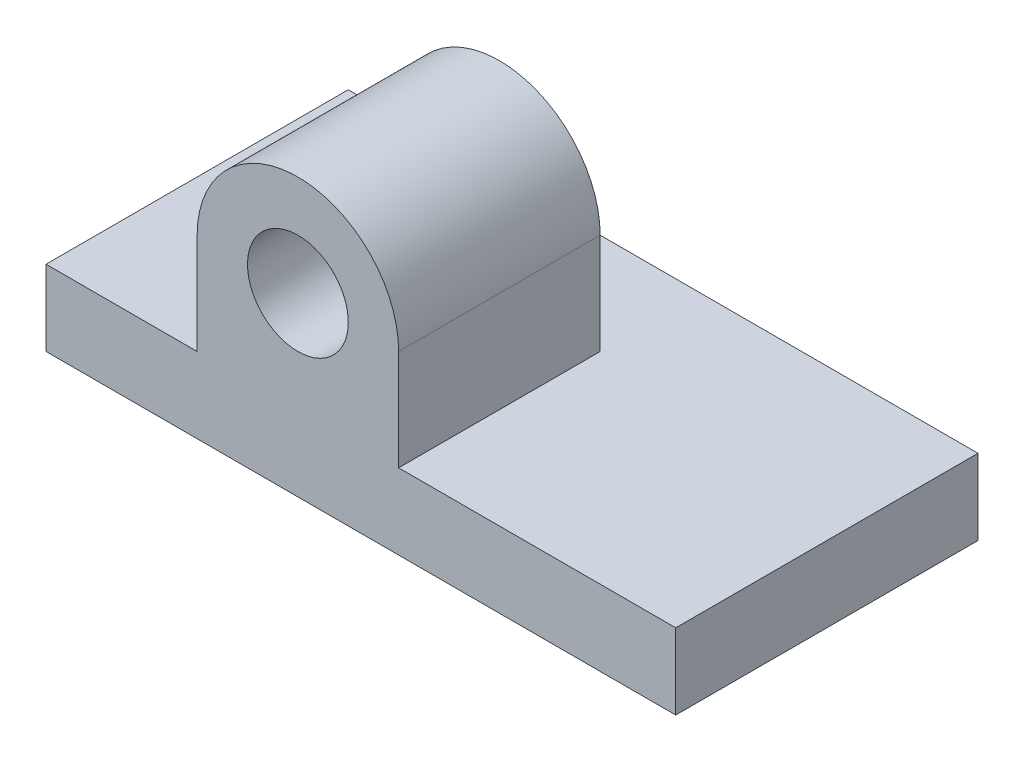
ISO-10303-21;
HEADER;
FILE_DESCRIPTION(('STEP AP214'),'2;1');
FILE_NAME('part.step','',(''),(''),'','','');
FILE_SCHEMA(('AUTOMOTIVE_DESIGN { 1 0 10303 214 1 1 1 1 }'));
ENDSEC;
DATA;
#1=APPLICATION_CONTEXT('core data for automotive mechanical design processes');
#2=APPLICATION_PROTOCOL_DEFINITION('international standard','automotive_design',2000,#1);
#3=PRODUCT_CONTEXT('',#1,'mechanical');
#4=PRODUCT('Part','Part','',(#3));
#5=PRODUCT_RELATED_PRODUCT_CATEGORY('part','',(#4));
#6=PRODUCT_DEFINITION_FORMATION('','',#4);
#7=PRODUCT_DEFINITION_CONTEXT('part definition',#1,'design');
#8=PRODUCT_DEFINITION('design','',#6,#7);
#9=PRODUCT_DEFINITION_SHAPE('','',#8);
#10=(LENGTH_UNIT() NAMED_UNIT(*) SI_UNIT(.MILLI.,.METRE.));
#11=(NAMED_UNIT(*) PLANE_ANGLE_UNIT() SI_UNIT($,.RADIAN.));
#12=(NAMED_UNIT(*) SI_UNIT($,.STERADIAN.) SOLID_ANGLE_UNIT());
#13=UNCERTAINTY_MEASURE_WITH_UNIT(LENGTH_MEASURE(1.E-05),#10,'distance_accuracy_value','');
#14=(GEOMETRIC_REPRESENTATION_CONTEXT(3) GLOBAL_UNCERTAINTY_ASSIGNED_CONTEXT((#13)) GLOBAL_UNIT_ASSIGNED_CONTEXT((#10,
#11,#12)) REPRESENTATION_CONTEXT('',''));
#15=CARTESIAN_POINT('',(0.,0.,0.));
#16=DIRECTION('',(0.,0.,1.));
#17=DIRECTION('',(1.,0.,0.));
#18=AXIS2_PLACEMENT_3D('',#15,#16,#17);
#19=CARTESIAN_POINT('',(0.,15.,-60.));
#20=DIRECTION('',(0.,-1.,0.));
#21=DIRECTION('',(0.,0.,-1.));
#22=AXIS2_PLACEMENT_3D('',#19,#20,#21);
#23=PLANE('',#22);
#24=DIRECTION('',(0.,0.,1.));
#25=VECTOR('',#24,1.);
#26=CARTESIAN_POINT('',(30.,15.,-40.));
#27=LINE('',#26,#25);
#28=CARTESIAN_POINT('',(30.,15.,-40.));
#29=VERTEX_POINT('',#28);
#30=CARTESIAN_POINT('',(30.,15.,0.));
#31=VERTEX_POINT('',#30);
#32=EDGE_CURVE('E135',#29,#31,#27,.T.);
#33=ORIENTED_EDGE('',*,*,#32,.F.);
#34=DIRECTION('',(1.,0.,0.));
#35=VECTOR('',#34,1.);
#36=CARTESIAN_POINT('',(0.,15.,-40.));
#37=LINE('',#36,#35);
#38=CARTESIAN_POINT('',(70.,15.,-40.));
#39=VERTEX_POINT('',#38);
#40=EDGE_CURVE('E123',#29,#39,#37,.T.);
#41=ORIENTED_EDGE('',*,*,#40,.T.);
#42=DIRECTION('',(0.,0.,1.));
#43=VECTOR('',#42,1.);
#44=CARTESIAN_POINT('',(70.,15.,-40.));
#45=LINE('',#44,#43);
#46=CARTESIAN_POINT('',(70.,15.,0.));
#47=VERTEX_POINT('',#46);
#48=EDGE_CURVE('E156',#39,#47,#45,.T.);
#49=ORIENTED_EDGE('',*,*,#48,.T.);
#50=DIRECTION('',(1.,0.,0.));
#51=VECTOR('',#50,1.);
#52=CARTESIAN_POINT('',(0.,15.,0.));
#53=LINE('',#52,#51);
#54=CARTESIAN_POINT('',(125.,15.,0.));
#55=VERTEX_POINT('',#54);
#56=EDGE_CURVE('E173',#47,#55,#53,.T.);
#57=ORIENTED_EDGE('',*,*,#56,.T.);
#58=DIRECTION('',(0.,0.,1.));
#59=VECTOR('',#58,1.);
#60=CARTESIAN_POINT('',(125.,15.,-60.));
#61=LINE('',#60,#59);
#62=CARTESIAN_POINT('',(125.,15.,-60.));
#63=VERTEX_POINT('',#62);
#64=EDGE_CURVE('E179',#63,#55,#61,.T.);
#65=ORIENTED_EDGE('',*,*,#64,.F.);
#66=DIRECTION('',(1.,0.,0.));
#67=VECTOR('',#66,1.);
#68=CARTESIAN_POINT('',(0.,15.,-60.));
#69=LINE('',#68,#67);
#70=CARTESIAN_POINT('',(0.,15.,-60.));
#71=VERTEX_POINT('',#70);
#72=EDGE_CURVE('E164',#71,#63,#69,.T.);
#73=ORIENTED_EDGE('',*,*,#72,.F.);
#74=DIRECTION('',(0.,0.,1.));
#75=VECTOR('',#74,1.);
#76=CARTESIAN_POINT('',(0.,15.,-60.));
#77=LINE('',#76,#75);
#78=CARTESIAN_POINT('',(0.,15.,0.));
#79=VERTEX_POINT('',#78);
#80=EDGE_CURVE('E52',#71,#79,#77,.T.);
#81=ORIENTED_EDGE('',*,*,#80,.T.);
#82=EDGE_CURVE('E174',#79,#31,#53,.T.);
#83=ORIENTED_EDGE('',*,*,#82,.T.);
#84=EDGE_LOOP('',(#33,#41,#49,#57,#65,#73,#81,#83));
#85=FACE_BOUND('',#84,.T.);
#86=ADVANCED_FACE('F43',(#85),#23,.F.);
#87=CARTESIAN_POINT('',(0.,0.,-60.));
#88=DIRECTION('',(0.,-1.,0.));
#89=DIRECTION('',(0.,0.,-1.));
#90=AXIS2_PLACEMENT_3D('',#87,#88,#89);
#91=PLANE('',#90);
#92=DIRECTION('',(1.,0.,0.));
#93=VECTOR('',#92,1.);
#94=CARTESIAN_POINT('',(0.,0.,0.));
#95=LINE('',#94,#93);
#96=CARTESIAN_POINT('',(0.,0.,0.));
#97=VERTEX_POINT('',#96);
#98=CARTESIAN_POINT('',(125.,0.,0.));
#99=VERTEX_POINT('',#98);
#100=EDGE_CURVE('E155',#97,#99,#95,.T.);
#101=ORIENTED_EDGE('',*,*,#100,.F.);
#102=DIRECTION('',(0.,0.,1.));
#103=VECTOR('',#102,1.);
#104=CARTESIAN_POINT('',(0.,0.,-60.));
#105=LINE('',#104,#103);
#106=CARTESIAN_POINT('',(0.,0.,-60.));
#107=VERTEX_POINT('',#106);
#108=EDGE_CURVE('E11',#107,#97,#105,.T.);
#109=ORIENTED_EDGE('',*,*,#108,.F.);
#110=DIRECTION('',(1.,0.,0.));
#111=VECTOR('',#110,1.);
#112=CARTESIAN_POINT('',(0.,0.,-60.));
#113=LINE('',#112,#111);
#114=CARTESIAN_POINT('',(125.,0.,-60.));
#115=VERTEX_POINT('',#114);
#116=EDGE_CURVE('E159',#107,#115,#113,.T.);
#117=ORIENTED_EDGE('',*,*,#116,.T.);
#118=DIRECTION('',(0.,0.,1.));
#119=VECTOR('',#118,1.);
#120=CARTESIAN_POINT('',(125.,0.,-60.));
#121=LINE('',#120,#119);
#122=EDGE_CURVE('E47',#115,#99,#121,.T.);
#123=ORIENTED_EDGE('',*,*,#122,.T.);
#124=EDGE_LOOP('',(#101,#109,#117,#123));
#125=FACE_BOUND('',#124,.T.);
#126=ADVANCED_FACE('F45',(#125),#91,.T.);
#127=CARTESIAN_POINT('',(0.,0.,-60.));
#128=DIRECTION('',(1.,0.,0.));
#129=DIRECTION('',(0.,0.,-1.));
#130=AXIS2_PLACEMENT_3D('',#127,#128,#129);
#131=PLANE('',#130);
#132=DIRECTION('',(0.,1.,0.));
#133=VECTOR('',#132,1.);
#134=CARTESIAN_POINT('',(0.,0.,0.));
#135=LINE('',#134,#133);
#136=EDGE_CURVE('E162',#97,#79,#135,.T.);
#137=ORIENTED_EDGE('',*,*,#136,.T.);
#138=ORIENTED_EDGE('',*,*,#80,.F.);
#139=DIRECTION('',(0.,1.,0.));
#140=VECTOR('',#139,1.);
#141=CARTESIAN_POINT('',(0.,0.,-60.));
#142=LINE('',#141,#140);
#143=EDGE_CURVE('E166',#107,#71,#142,.T.);
#144=ORIENTED_EDGE('',*,*,#143,.F.);
#145=ORIENTED_EDGE('',*,*,#108,.T.);
#146=EDGE_LOOP('',(#137,#138,#144,#145));
#147=FACE_BOUND('',#146,.T.);
#148=ADVANCED_FACE('F190',(#147),#131,.F.);
#149=CARTESIAN_POINT('',(125.,0.,-60.));
#150=DIRECTION('',(1.,0.,0.));
#151=DIRECTION('',(0.,0.,-1.));
#152=AXIS2_PLACEMENT_3D('',#149,#150,#151);
#153=PLANE('',#152);
#154=DIRECTION('',(0.,1.,0.));
#155=VECTOR('',#154,1.);
#156=CARTESIAN_POINT('',(125.,0.,0.));
#157=LINE('',#156,#155);
#158=EDGE_CURVE('E170',#99,#55,#157,.T.);
#159=ORIENTED_EDGE('',*,*,#158,.F.);
#160=ORIENTED_EDGE('',*,*,#122,.F.);
#161=DIRECTION('',(0.,1.,0.));
#162=VECTOR('',#161,1.);
#163=CARTESIAN_POINT('',(125.,0.,-60.));
#164=LINE('',#163,#162);
#165=EDGE_CURVE('E161',#115,#63,#164,.T.);
#166=ORIENTED_EDGE('',*,*,#165,.T.);
#167=ORIENTED_EDGE('',*,*,#64,.T.);
#168=EDGE_LOOP('',(#159,#160,#166,#167));
#169=FACE_BOUND('',#168,.T.);
#170=ADVANCED_FACE('F183',(#169),#153,.T.);
#171=CARTESIAN_POINT('',(0.,0.,-60.));
#172=DIRECTION('',(0.,0.,1.));
#173=DIRECTION('',(1.,0.,0.));
#174=AXIS2_PLACEMENT_3D('',#171,#172,#173);
#175=PLANE('',#174);
#176=ORIENTED_EDGE('',*,*,#116,.F.);
#177=ORIENTED_EDGE('',*,*,#143,.T.);
#178=ORIENTED_EDGE('',*,*,#72,.T.);
#179=ORIENTED_EDGE('',*,*,#165,.F.);
#180=EDGE_LOOP('',(#176,#177,#178,#179));
#181=FACE_BOUND('',#180,.T.);
#182=ADVANCED_FACE('F194',(#181),#175,.F.);
#183=CARTESIAN_POINT('',(0.,0.,0.));
#184=DIRECTION('',(0.,0.,1.));
#185=DIRECTION('',(1.,0.,0.));
#186=AXIS2_PLACEMENT_3D('',#183,#184,#185);
#187=PLANE('',#186);
#188=ORIENTED_EDGE('',*,*,#100,.T.);
#189=ORIENTED_EDGE('',*,*,#158,.T.);
#190=ORIENTED_EDGE('',*,*,#56,.F.);
#191=DIRECTION('',(0.,-1.,0.));
#192=VECTOR('',#191,1.);
#193=CARTESIAN_POINT('',(70.,0.,0.));
#194=LINE('',#193,#192);
#195=CARTESIAN_POINT('',(70.,35.,0.));
#196=VERTEX_POINT('',#195);
#197=EDGE_CURVE('E60',#196,#47,#194,.T.);
#198=ORIENTED_EDGE('',*,*,#197,.F.);
#199=CARTESIAN_POINT('',(50.,35.,0.));
#200=DIRECTION('',(0.,0.,1.));
#201=DIRECTION('',(1.,0.,0.));
#202=AXIS2_PLACEMENT_3D('',#199,#200,#201);
#203=CIRCLE('',#202,20.);
#204=CARTESIAN_POINT('',(30.,35.,0.));
#205=VERTEX_POINT('',#204);
#206=EDGE_CURVE('E150',#205,#196,#203,.F.);
#207=ORIENTED_EDGE('',*,*,#206,.F.);
#208=DIRECTION('',(0.,1.,0.));
#209=VECTOR('',#208,1.);
#210=CARTESIAN_POINT('',(30.,0.,0.));
#211=LINE('',#210,#209);
#212=EDGE_CURVE('E131',#31,#205,#211,.T.);
#213=ORIENTED_EDGE('',*,*,#212,.F.);
#214=ORIENTED_EDGE('',*,*,#82,.F.);
#215=ORIENTED_EDGE('',*,*,#136,.F.);
#216=EDGE_LOOP('',(#188,#189,#190,#198,#207,#213,#214,#215));
#217=FACE_BOUND('',#216,.T.);
#218=CARTESIAN_POINT('',(50.,35.,0.));
#219=DIRECTION('',(0.,0.,1.));
#220=DIRECTION('',(1.,0.,0.));
#221=AXIS2_PLACEMENT_3D('',#218,#219,#220);
#222=CIRCLE('',#221,10.);
#223=CARTESIAN_POINT('',(60.,35.,0.));
#224=VERTEX_POINT('',#223);
#225=EDGE_CURVE('E147',#224,#224,#222,.T.);
#226=ORIENTED_EDGE('',*,*,#225,.F.);
#227=EDGE_LOOP('',(#226));
#228=FACE_BOUND('',#227,.T.);
#229=ADVANCED_FACE('F186',(#217,#228),#187,.T.);
#230=CARTESIAN_POINT('',(50.,35.,-40.));
#231=DIRECTION('',(0.,0.,1.));
#232=DIRECTION('',(1.,0.,0.));
#233=AXIS2_PLACEMENT_3D('',#230,#231,#232);
#234=CYLINDRICAL_SURFACE('',#233,20.);
#235=ORIENTED_EDGE('',*,*,#206,.T.);
#236=DIRECTION('',(0.,0.,1.));
#237=VECTOR('',#236,1.);
#238=CARTESIAN_POINT('',(70.,35.,-40.));
#239=LINE('',#238,#237);
#240=CARTESIAN_POINT('',(70.,35.,-40.));
#241=VERTEX_POINT('',#240);
#242=EDGE_CURVE('E139',#241,#196,#239,.T.);
#243=ORIENTED_EDGE('',*,*,#242,.F.);
#244=CARTESIAN_POINT('',(50.,35.,-40.));
#245=DIRECTION('',(0.,0.,1.));
#246=DIRECTION('',(1.,0.,0.));
#247=AXIS2_PLACEMENT_3D('',#244,#245,#246);
#248=CIRCLE('',#247,20.);
#249=CARTESIAN_POINT('',(30.,35.,-40.));
#250=VERTEX_POINT('',#249);
#251=EDGE_CURVE('E120',#250,#241,#248,.F.);
#252=ORIENTED_EDGE('',*,*,#251,.F.);
#253=DIRECTION('',(0.,0.,1.));
#254=VECTOR('',#253,1.);
#255=CARTESIAN_POINT('',(30.,35.,-40.));
#256=LINE('',#255,#254);
#257=EDGE_CURVE('E128',#250,#205,#256,.T.);
#258=ORIENTED_EDGE('',*,*,#257,.T.);
#259=EDGE_LOOP('',(#235,#243,#252,#258));
#260=FACE_BOUND('',#259,.T.);
#261=ADVANCED_FACE('F138',(#260),#234,.T.);
#262=CARTESIAN_POINT('',(70.,0.,-40.));
#263=DIRECTION('',(-1.,0.,0.));
#264=DIRECTION('',(0.,0.,1.));
#265=AXIS2_PLACEMENT_3D('',#262,#263,#264);
#266=PLANE('',#265);
#267=ORIENTED_EDGE('',*,*,#197,.T.);
#268=ORIENTED_EDGE('',*,*,#48,.F.);
#269=DIRECTION('',(0.,-1.,0.));
#270=VECTOR('',#269,1.);
#271=CARTESIAN_POINT('',(70.,0.,-40.));
#272=LINE('',#271,#270);
#273=EDGE_CURVE('E136',#241,#39,#272,.T.);
#274=ORIENTED_EDGE('',*,*,#273,.F.);
#275=ORIENTED_EDGE('',*,*,#242,.T.);
#276=EDGE_LOOP('',(#267,#268,#274,#275));
#277=FACE_BOUND('',#276,.T.);
#278=ADVANCED_FACE('F244',(#277),#266,.F.);
#279=CARTESIAN_POINT('',(50.,35.,-40.));
#280=DIRECTION('',(0.,0.,1.));
#281=DIRECTION('',(1.,0.,0.));
#282=AXIS2_PLACEMENT_3D('',#279,#280,#281);
#283=CYLINDRICAL_SURFACE('',#282,10.);
#284=CARTESIAN_POINT('',(50.,35.,-40.));
#285=DIRECTION('',(0.,0.,1.));
#286=DIRECTION('',(1.,0.,0.));
#287=AXIS2_PLACEMENT_3D('',#284,#285,#286);
#288=CIRCLE('',#287,10.);
#289=CARTESIAN_POINT('',(60.,35.,-40.));
#290=VERTEX_POINT('',#289);
#291=EDGE_CURVE('E140',#290,#290,#288,.T.);
#292=ORIENTED_EDGE('',*,*,#291,.F.);
#293=EDGE_LOOP('',(#292));
#294=FACE_BOUND('',#293,.T.);
#295=ORIENTED_EDGE('',*,*,#225,.T.);
#296=EDGE_LOOP('',(#295));
#297=FACE_BOUND('',#296,.T.);
#298=ADVANCED_FACE('F252',(#294,#297),#283,.F.);
#299=CARTESIAN_POINT('',(30.,0.,-40.));
#300=DIRECTION('',(1.,0.,0.));
#301=DIRECTION('',(0.,0.,-1.));
#302=AXIS2_PLACEMENT_3D('',#299,#300,#301);
#303=PLANE('',#302);
#304=ORIENTED_EDGE('',*,*,#212,.T.);
#305=ORIENTED_EDGE('',*,*,#257,.F.);
#306=DIRECTION('',(0.,1.,0.));
#307=VECTOR('',#306,1.);
#308=CARTESIAN_POINT('',(30.,0.,-40.));
#309=LINE('',#308,#307);
#310=EDGE_CURVE('E116',#29,#250,#309,.T.);
#311=ORIENTED_EDGE('',*,*,#310,.F.);
#312=ORIENTED_EDGE('',*,*,#32,.T.);
#313=EDGE_LOOP('',(#304,#305,#311,#312));
#314=FACE_BOUND('',#313,.T.);
#315=ADVANCED_FACE('F129',(#314),#303,.F.);
#316=CARTESIAN_POINT('',(0.,0.,-40.));
#317=DIRECTION('',(0.,0.,1.));
#318=DIRECTION('',(1.,0.,0.));
#319=AXIS2_PLACEMENT_3D('',#316,#317,#318);
#320=PLANE('',#319);
#321=ORIENTED_EDGE('',*,*,#291,.T.);
#322=EDGE_LOOP('',(#321));
#323=FACE_BOUND('',#322,.T.);
#324=ORIENTED_EDGE('',*,*,#251,.T.);
#325=ORIENTED_EDGE('',*,*,#273,.T.);
#326=ORIENTED_EDGE('',*,*,#40,.F.);
#327=ORIENTED_EDGE('',*,*,#310,.T.);
#328=EDGE_LOOP('',(#324,#325,#326,#327));
#329=FACE_BOUND('',#328,.T.);
#330=ADVANCED_FACE('F118',(#323,#329),#320,.F.);
#331=CLOSED_SHELL('',(#86,#126,#148,#170,#182,#229,#261,#278,#298,#315,#330));
#332=MANIFOLD_SOLID_BREP('B2',#331);
#333=ADVANCED_BREP_SHAPE_REPRESENTATION('',(#18,#332),#14);
#334=SHAPE_DEFINITION_REPRESENTATION(#9,#333);
ENDSEC;
END-ISO-10303-21;
